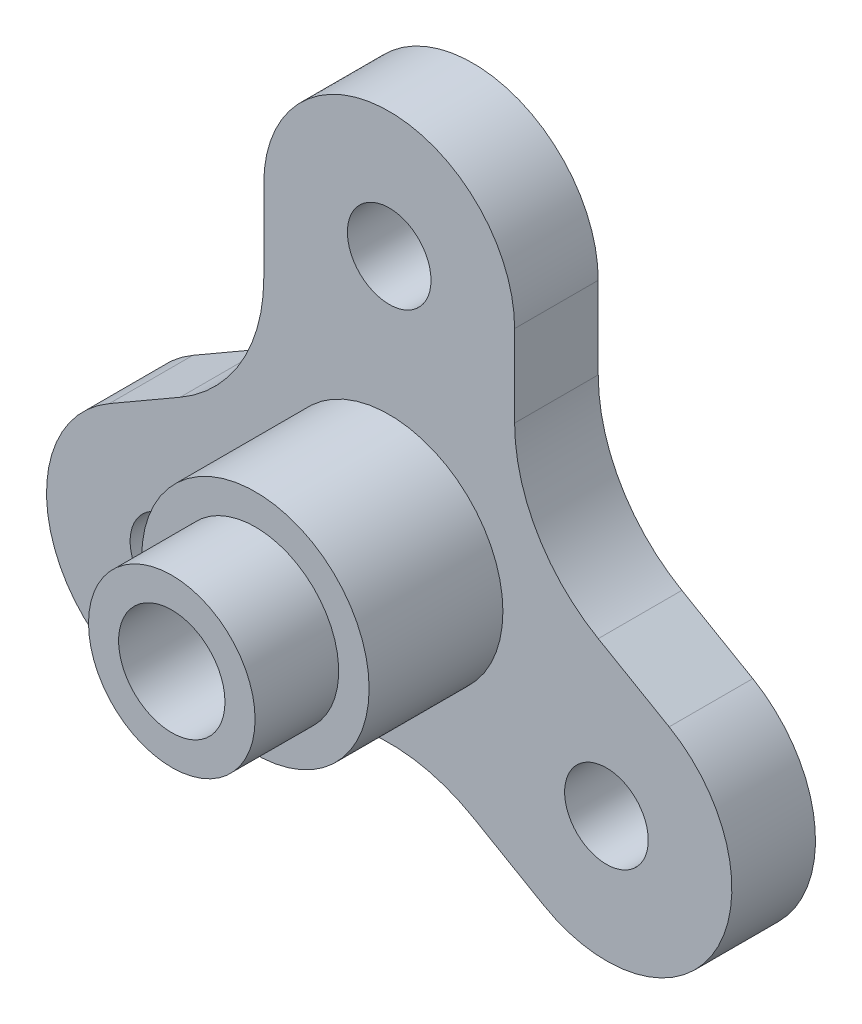
ISO-10303-21;
HEADER;
FILE_DESCRIPTION(('STEP AP214'),'2;1');
FILE_NAME('part.step','',(''),(''),'','','');
FILE_SCHEMA(('AUTOMOTIVE_DESIGN { 1 0 10303 214 1 1 1 1 }'));
ENDSEC;
DATA;
#1=APPLICATION_CONTEXT('core data for automotive mechanical design processes');
#2=APPLICATION_PROTOCOL_DEFINITION('international standard','automotive_design',2000,#1);
#3=PRODUCT_CONTEXT('',#1,'mechanical');
#4=PRODUCT('Part','Part','',(#3));
#5=PRODUCT_RELATED_PRODUCT_CATEGORY('part','',(#4));
#6=PRODUCT_DEFINITION_FORMATION('','',#4);
#7=PRODUCT_DEFINITION_CONTEXT('part definition',#1,'design');
#8=PRODUCT_DEFINITION('design','',#6,#7);
#9=PRODUCT_DEFINITION_SHAPE('','',#8);
#10=(LENGTH_UNIT() NAMED_UNIT(*) SI_UNIT(.MILLI.,.METRE.));
#11=(NAMED_UNIT(*) PLANE_ANGLE_UNIT() SI_UNIT($,.RADIAN.));
#12=(NAMED_UNIT(*) SI_UNIT($,.STERADIAN.) SOLID_ANGLE_UNIT());
#13=UNCERTAINTY_MEASURE_WITH_UNIT(LENGTH_MEASURE(1.E-05),#10,'distance_accuracy_value','');
#14=(GEOMETRIC_REPRESENTATION_CONTEXT(3) GLOBAL_UNCERTAINTY_ASSIGNED_CONTEXT((#13)) GLOBAL_UNIT_ASSIGNED_CONTEXT((#10,
#11,#12)) REPRESENTATION_CONTEXT('',''));
#15=CARTESIAN_POINT('',(0.,0.,0.));
#16=DIRECTION('',(0.,0.,1.));
#17=DIRECTION('',(1.,0.,0.));
#18=AXIS2_PLACEMENT_3D('',#15,#16,#17);
#19=CARTESIAN_POINT('',(0.,2.0193,0.));
#20=DIRECTION('',(0.,0.,-1.));
#21=DIRECTION('',(-1.,0.,0.));
#22=AXIS2_PLACEMENT_3D('',#19,#20,#21);
#23=PLANE('',#22);
#24=CARTESIAN_POINT('',(0.,0.,0.));
#25=DIRECTION('',(0.,0.,1.));
#26=DIRECTION('',(1.,0.,0.));
#27=AXIS2_PLACEMENT_3D('',#24,#25,#26);
#28=CIRCLE('',#27,4.318);
#29=CARTESIAN_POINT('',(4.318,0.,0.));
#30=VERTEX_POINT('',#29);
#31=EDGE_CURVE('E199',#30,#30,#28,.T.);
#32=ORIENTED_EDGE('',*,*,#31,.T.);
#33=EDGE_LOOP('',(#32));
#34=FACE_BOUND('',#33,.T.);
#35=CARTESIAN_POINT('',(0.,0.,0.));
#36=DIRECTION('',(0.,0.,-1.));
#37=DIRECTION('',(-1.,0.,0.));
#38=AXIS2_PLACEMENT_3D('',#35,#36,#37);
#39=CIRCLE('',#38,3.1623);
#40=CARTESIAN_POINT('',(-3.1623,0.,0.));
#41=VERTEX_POINT('',#40);
#42=EDGE_CURVE('E11',#41,#41,#39,.F.);
#43=ORIENTED_EDGE('',*,*,#42,.F.);
#44=EDGE_LOOP('',(#43));
#45=FACE_BOUND('',#44,.T.);
#46=ADVANCED_FACE('F34',(#34,#45),#23,.F.);
#47=CARTESIAN_POINT('',(0.,0.,0.));
#48=DIRECTION('',(0.,0.,1.));
#49=DIRECTION('',(1.,0.,0.));
#50=AXIS2_PLACEMENT_3D('',#47,#48,#49);
#51=CYLINDRICAL_SURFACE('',#50,2.0193);
#52=CARTESIAN_POINT('',(0.,0.,-8.255));
#53=DIRECTION('',(0.,0.,1.));
#54=DIRECTION('',(1.,0.,0.));
#55=AXIS2_PLACEMENT_3D('',#52,#53,#54);
#56=CIRCLE('',#55,2.0193);
#57=CARTESIAN_POINT('',(2.0193,0.,-8.255));
#58=VERTEX_POINT('',#57);
#59=EDGE_CURVE('E193',#58,#58,#56,.T.);
#60=ORIENTED_EDGE('',*,*,#59,.F.);
#61=EDGE_LOOP('',(#60));
#62=FACE_BOUND('',#61,.T.);
#63=CARTESIAN_POINT('',(0.,0.,3.175));
#64=DIRECTION('',(0.,0.,1.));
#65=DIRECTION('',(1.,0.,0.));
#66=AXIS2_PLACEMENT_3D('',#63,#64,#65);
#67=CIRCLE('',#66,2.0193);
#68=CARTESIAN_POINT('',(2.0193,0.,3.175));
#69=VERTEX_POINT('',#68);
#70=EDGE_CURVE('E390',#69,#69,#67,.T.);
#71=ORIENTED_EDGE('',*,*,#70,.T.);
#72=EDGE_LOOP('',(#71));
#73=FACE_BOUND('',#72,.T.);
#74=ADVANCED_FACE('F271',(#62,#73),#51,.F.);
#75=CARTESIAN_POINT('',(0.,0.,0.));
#76=DIRECTION('',(0.,0.,1.));
#77=DIRECTION('',(1.,0.,0.));
#78=AXIS2_PLACEMENT_3D('',#75,#76,#77);
#79=CYLINDRICAL_SURFACE('',#78,4.318);
#80=ORIENTED_EDGE('',*,*,#31,.F.);
#81=EDGE_LOOP('',(#80));
#82=FACE_BOUND('',#81,.T.);
#83=CARTESIAN_POINT('',(0.,0.,-5.08));
#84=DIRECTION('',(0.,0.,1.));
#85=DIRECTION('',(1.,0.,0.));
#86=AXIS2_PLACEMENT_3D('',#83,#84,#85);
#87=CIRCLE('',#86,4.318);
#88=CARTESIAN_POINT('',(4.318,0.,-5.08));
#89=VERTEX_POINT('',#88);
#90=EDGE_CURVE('E196',#89,#89,#87,.T.);
#91=ORIENTED_EDGE('',*,*,#90,.T.);
#92=EDGE_LOOP('',(#91));
#93=FACE_BOUND('',#92,.T.);
#94=ADVANCED_FACE('F277',(#82,#93),#79,.T.);
#95=CARTESIAN_POINT('',(0.,4.318,-5.08));
#96=DIRECTION('',(0.,0.,-1.));
#97=DIRECTION('',(-1.,0.,0.));
#98=AXIS2_PLACEMENT_3D('',#95,#96,#97);
#99=PLANE('',#98);
#100=DIRECTION('',(0.866025403784436,0.500000000000004,0.));
#101=VECTOR('',#100,1.);
#102=CARTESIAN_POINT('',(2.38124999999988,-4.12444598552313,-5.08));
#103=LINE('',#102,#101);
#104=CARTESIAN_POINT('',(-5.86764197104688,-8.88694598552317,-5.08));
#105=VERTEX_POINT('',#104);
#106=CARTESIAN_POINT('',(-3.17500000000047,-7.33234841870823,-5.08));
#107=VERTEX_POINT('',#106);
#108=EDGE_CURVE('E143',#105,#107,#103,.T.);
#109=ORIENTED_EDGE('',*,*,#108,.T.);
#110=CARTESIAN_POINT('',(-4.40619762898109E-13,-12.8316097327394,-5.08));
#111=DIRECTION('',(0.,0.,-1.));
#112=DIRECTION('',(-1.,0.,0.));
#113=AXIS2_PLACEMENT_3D('',#110,#111,#112);
#114=CIRCLE('',#113,6.35);
#115=CARTESIAN_POINT('',(3.17499999999957,-7.33234841870822,-5.08));
#116=VERTEX_POINT('',#115);
#117=EDGE_CURVE('E241',#107,#116,#114,.T.);
#118=ORIENTED_EDGE('',*,*,#117,.T.);
#119=DIRECTION('',(-0.866025403784438,0.500000000000001,0.));
#120=VECTOR('',#119,1.);
#121=CARTESIAN_POINT('',(-2.3812500000001,-4.12444598552354,-5.08));
#122=LINE('',#121,#120);
#123=CARTESIAN_POINT('',(5.86764197104666,-8.88694598552354,-5.08));
#124=VERTEX_POINT('',#123);
#125=EDGE_CURVE('E164',#124,#116,#122,.T.);
#126=ORIENTED_EDGE('',*,*,#125,.F.);
#127=CARTESIAN_POINT('',(8.24889197104668,-4.76250000000017,-5.08));
#128=DIRECTION('',(0.,0.,1.));
#129=DIRECTION('',(1.,0.,0.));
#130=AXIS2_PLACEMENT_3D('',#127,#128,#129);
#131=CIRCLE('',#130,4.7625);
#132=CARTESIAN_POINT('',(10.6301419710467,-0.638054014476789,-5.08));
#133=VERTEX_POINT('',#132);
#134=EDGE_CURVE('E161',#124,#133,#131,.T.);
#135=ORIENTED_EDGE('',*,*,#134,.T.);
#136=DIRECTION('',(-0.866025403784436,0.500000000000004,0.));
#137=VECTOR('',#136,1.);
#138=CARTESIAN_POINT('',(2.38124999999994,4.12444598552325,-5.08));
#139=LINE('',#138,#137);
#140=CARTESIAN_POINT('',(7.93750000000026,0.916543552338175,-5.08));
#141=VERTEX_POINT('',#140);
#142=EDGE_CURVE('E159',#133,#141,#139,.T.);
#143=ORIENTED_EDGE('',*,*,#142,.T.);
#144=CARTESIAN_POINT('',(11.1125000000003,6.41580486636934,-5.08));
#145=DIRECTION('',(0.,0.,-1.));
#146=DIRECTION('',(-1.,0.,0.));
#147=AXIS2_PLACEMENT_3D('',#144,#145,#146);
#148=CIRCLE('',#147,6.35);
#149=CARTESIAN_POINT('',(4.76250000000028,6.41580486636934,-5.08));
#150=VERTEX_POINT('',#149);
#151=EDGE_CURVE('E57',#141,#150,#148,.T.);
#152=ORIENTED_EDGE('',*,*,#151,.T.);
#153=DIRECTION('',(0.,-1.,0.));
#154=VECTOR('',#153,1.);
#155=CARTESIAN_POINT('',(4.76250000000028,0.,-5.08));
#156=LINE('',#155,#154);
#157=CARTESIAN_POINT('',(4.76250000000028,9.525,-5.08));
#158=VERTEX_POINT('',#157);
#159=EDGE_CURVE('E157',#158,#150,#156,.T.);
#160=ORIENTED_EDGE('',*,*,#159,.F.);
#161=CARTESIAN_POINT('',(2.81579709548073E-13,9.525,-5.08));
#162=DIRECTION('',(0.,0.,1.));
#163=DIRECTION('',(1.,0.,0.));
#164=AXIS2_PLACEMENT_3D('',#161,#162,#163);
#165=CIRCLE('',#164,4.7625);
#166=CARTESIAN_POINT('',(-4.76249999999972,9.525,-5.08));
#167=VERTEX_POINT('',#166);
#168=EDGE_CURVE('E151',#167,#158,#165,.F.);
#169=ORIENTED_EDGE('',*,*,#168,.F.);
#170=DIRECTION('',(0.,-1.,0.));
#171=VECTOR('',#170,1.);
#172=CARTESIAN_POINT('',(-4.76249999999972,0.,-5.08));
#173=LINE('',#172,#171);
#174=CARTESIAN_POINT('',(-4.76249999999972,6.41580486637017,-5.08));
#175=VERTEX_POINT('',#174);
#176=EDGE_CURVE('E149',#167,#175,#173,.T.);
#177=ORIENTED_EDGE('',*,*,#176,.T.);
#178=CARTESIAN_POINT('',(-11.1124999999997,6.41580486637017,-5.08));
#179=DIRECTION('',(0.,0.,-1.));
#180=DIRECTION('',(-1.,0.,0.));
#181=AXIS2_PLACEMENT_3D('',#178,#179,#180);
#182=CIRCLE('',#181,6.35);
#183=CARTESIAN_POINT('',(-7.93749999999969,0.916543552339002,-5.08));
#184=VERTEX_POINT('',#183);
#185=EDGE_CURVE('E148',#175,#184,#182,.T.);
#186=ORIENTED_EDGE('',*,*,#185,.T.);
#187=DIRECTION('',(0.866025403784436,0.500000000000004,0.));
#188=VECTOR('',#187,1.);
#189=CARTESIAN_POINT('',(-2.38125000000016,4.12444598552362,-5.08));
#190=LINE('',#189,#188);
#191=CARTESIAN_POINT('',(-10.6301419710469,-0.638054014476417,-5.08));
#192=VERTEX_POINT('',#191);
#193=EDGE_CURVE('E128',#192,#184,#190,.T.);
#194=ORIENTED_EDGE('',*,*,#193,.F.);
#195=CARTESIAN_POINT('',(-8.2488919710469,-4.7624999999998,-5.08));
#196=DIRECTION('',(0.,0.,1.));
#197=DIRECTION('',(1.,0.,0.));
#198=AXIS2_PLACEMENT_3D('',#195,#196,#197);
#199=CIRCLE('',#198,4.7625);
#200=EDGE_CURVE('E139',#105,#192,#199,.F.);
#201=ORIENTED_EDGE('',*,*,#200,.F.);
#202=EDGE_LOOP('',(#109,#118,#126,#135,#143,#152,#160,#169,#177,#186,#194,#201));
#203=FACE_BOUND('',#202,.T.);
#204=CARTESIAN_POINT('',(8.24889197104668,-4.76250000000017,-5.08));
#205=DIRECTION('',(0.,0.,1.));
#206=DIRECTION('',(1.,0.,0.));
#207=AXIS2_PLACEMENT_3D('',#204,#205,#206);
#208=CIRCLE('',#207,1.5875);
#209=CARTESIAN_POINT('',(9.83639197104668,-4.76250000000017,-5.08));
#210=VERTEX_POINT('',#209);
#211=EDGE_CURVE('E169',#210,#210,#208,.T.);
#212=ORIENTED_EDGE('',*,*,#211,.F.);
#213=EDGE_LOOP('',(#212));
#214=FACE_BOUND('',#213,.T.);
#215=CARTESIAN_POINT('',(-8.2488919710469,-4.7624999999998,-5.08));
#216=DIRECTION('',(0.,0.,1.));
#217=DIRECTION('',(1.,0.,0.));
#218=AXIS2_PLACEMENT_3D('',#215,#216,#217);
#219=CIRCLE('',#218,1.5875);
#220=CARTESIAN_POINT('',(-6.6613919710469,-4.7624999999998,-5.08));
#221=VERTEX_POINT('',#220);
#222=EDGE_CURVE('E181',#221,#221,#219,.T.);
#223=ORIENTED_EDGE('',*,*,#222,.F.);
#224=EDGE_LOOP('',(#223));
#225=FACE_BOUND('',#224,.T.);
#226=CARTESIAN_POINT('',(2.81579709548073E-13,9.525,-5.08));
#227=DIRECTION('',(0.,0.,1.));
#228=DIRECTION('',(1.,0.,0.));
#229=AXIS2_PLACEMENT_3D('',#226,#227,#228);
#230=CIRCLE('',#229,1.5875);
#231=CARTESIAN_POINT('',(1.58750000000028,9.525,-5.08));
#232=VERTEX_POINT('',#231);
#233=EDGE_CURVE('E187',#232,#232,#230,.T.);
#234=ORIENTED_EDGE('',*,*,#233,.F.);
#235=EDGE_LOOP('',(#234));
#236=FACE_BOUND('',#235,.T.);
#237=ORIENTED_EDGE('',*,*,#90,.F.);
#238=EDGE_LOOP('',(#237));
#239=FACE_BOUND('',#238,.T.);
#240=ADVANCED_FACE('F145',(#203,#214,#225,#236,#239),#99,.F.);
#241=CARTESIAN_POINT('',(0.,15.875,-8.255));
#242=DIRECTION('',(0.,0.,1.));
#243=DIRECTION('',(1.,0.,0.));
#244=AXIS2_PLACEMENT_3D('',#241,#242,#243);
#245=PLANE('',#244);
#246=DIRECTION('',(0.866025403784436,0.500000000000004,0.));
#247=VECTOR('',#246,1.);
#248=CARTESIAN_POINT('',(9.2553266425389,-0.155695985523067,-8.255));
#249=LINE('',#248,#247);
#250=CARTESIAN_POINT('',(-5.86764197104688,-8.88694598552317,-8.255));
#251=VERTEX_POINT('',#250);
#252=CARTESIAN_POINT('',(-3.17500000000047,-7.33234841870823,-8.255));
#253=VERTEX_POINT('',#252);
#254=EDGE_CURVE('E221',#251,#253,#249,.T.);
#255=ORIENTED_EDGE('',*,*,#254,.F.);
#256=CARTESIAN_POINT('',(-8.2488919710469,-4.7624999999998,-8.255));
#257=DIRECTION('',(0.,0.,1.));
#258=DIRECTION('',(1.,0.,0.));
#259=AXIS2_PLACEMENT_3D('',#256,#257,#258);
#260=CIRCLE('',#259,4.7625);
#261=CARTESIAN_POINT('',(-10.6301419710469,-0.638054014476417,-8.255));
#262=VERTEX_POINT('',#261);
#263=EDGE_CURVE('E202',#251,#262,#260,.F.);
#264=ORIENTED_EDGE('',*,*,#263,.T.);
#265=DIRECTION('',(0.866025403784436,0.500000000000004,0.));
#266=VECTOR('',#265,1.);
#267=CARTESIAN_POINT('',(4.49282664253886,8.09319598552368,-8.255));
#268=LINE('',#267,#266);
#269=CARTESIAN_POINT('',(-7.93749999999969,0.916543552338999,-8.255));
#270=VERTEX_POINT('',#269);
#271=EDGE_CURVE('E131',#262,#270,#268,.T.);
#272=ORIENTED_EDGE('',*,*,#271,.T.);
#273=CARTESIAN_POINT('',(-11.1124999999997,6.41580486637017,-8.255));
#274=DIRECTION('',(0.,0.,1.));
#275=DIRECTION('',(1.,0.,0.));
#276=AXIS2_PLACEMENT_3D('',#273,#274,#275);
#277=CIRCLE('',#276,6.35);
#278=CARTESIAN_POINT('',(-4.76249999999972,6.41580486637017,-8.255));
#279=VERTEX_POINT('',#278);
#280=EDGE_CURVE('E239',#270,#279,#277,.T.);
#281=ORIENTED_EDGE('',*,*,#280,.T.);
#282=DIRECTION('',(0.,-1.,0.));
#283=VECTOR('',#282,1.);
#284=CARTESIAN_POINT('',(-4.76249999999972,15.875,-8.255));
#285=LINE('',#284,#283);
#286=CARTESIAN_POINT('',(-4.76249999999972,9.525,-8.255));
#287=VERTEX_POINT('',#286);
#288=EDGE_CURVE('E205',#287,#279,#285,.T.);
#289=ORIENTED_EDGE('',*,*,#288,.F.);
#290=CARTESIAN_POINT('',(2.81579709548073E-13,9.525,-8.255));
#291=DIRECTION('',(0.,0.,1.));
#292=DIRECTION('',(1.,0.,0.));
#293=AXIS2_PLACEMENT_3D('',#290,#291,#292);
#294=CIRCLE('',#293,4.7625);
#295=CARTESIAN_POINT('',(4.76250000000028,9.525,-8.255));
#296=VERTEX_POINT('',#295);
#297=EDGE_CURVE('E208',#287,#296,#294,.F.);
#298=ORIENTED_EDGE('',*,*,#297,.T.);
#299=DIRECTION('',(0.,-1.,0.));
#300=VECTOR('',#299,1.);
#301=CARTESIAN_POINT('',(4.76250000000028,15.875,-8.255));
#302=LINE('',#301,#300);
#303=CARTESIAN_POINT('',(4.76250000000028,6.41580486636934,-8.255));
#304=VERTEX_POINT('',#303);
#305=EDGE_CURVE('E211',#296,#304,#302,.T.);
#306=ORIENTED_EDGE('',*,*,#305,.T.);
#307=CARTESIAN_POINT('',(11.1125000000003,6.41580486636934,-8.255));
#308=DIRECTION('',(0.,0.,1.));
#309=DIRECTION('',(1.,0.,0.));
#310=AXIS2_PLACEMENT_3D('',#307,#308,#309);
#311=CIRCLE('',#310,6.35);
#312=CARTESIAN_POINT('',(7.93750000000026,0.916543552338173,-8.255));
#313=VERTEX_POINT('',#312);
#314=EDGE_CURVE('E42',#304,#313,#311,.T.);
#315=ORIENTED_EDGE('',*,*,#314,.T.);
#316=DIRECTION('',(-0.866025403784436,0.500000000000004,0.));
#317=VECTOR('',#316,1.);
#318=CARTESIAN_POINT('',(-4.49282664253908,8.09319598552331,-8.255));
#319=LINE('',#318,#317);
#320=CARTESIAN_POINT('',(10.6301419710467,-0.638054014476789,-8.255));
#321=VERTEX_POINT('',#320);
#322=EDGE_CURVE('E213',#321,#313,#319,.T.);
#323=ORIENTED_EDGE('',*,*,#322,.F.);
#324=CARTESIAN_POINT('',(8.24889197104668,-4.76250000000017,-8.255));
#325=DIRECTION('',(0.,0.,1.));
#326=DIRECTION('',(1.,0.,0.));
#327=AXIS2_PLACEMENT_3D('',#324,#325,#326);
#328=CIRCLE('',#327,4.7625);
#329=CARTESIAN_POINT('',(5.86764197104666,-8.88694598552354,-8.255));
#330=VERTEX_POINT('',#329);
#331=EDGE_CURVE('E216',#330,#321,#328,.T.);
#332=ORIENTED_EDGE('',*,*,#331,.F.);
#333=DIRECTION('',(-0.866025403784438,0.500000000000001,0.));
#334=VECTOR('',#333,1.);
#335=CARTESIAN_POINT('',(-9.25532664253909,-0.155695985523528,-8.255));
#336=LINE('',#335,#334);
#337=CARTESIAN_POINT('',(3.17499999999957,-7.33234841870822,-8.255));
#338=VERTEX_POINT('',#337);
#339=EDGE_CURVE('E218',#330,#338,#336,.T.);
#340=ORIENTED_EDGE('',*,*,#339,.T.);
#341=CARTESIAN_POINT('',(-4.40619762898109E-13,-12.8316097327394,-8.255));
#342=DIRECTION('',(0.,0.,1.));
#343=DIRECTION('',(1.,0.,0.));
#344=AXIS2_PLACEMENT_3D('',#341,#342,#343);
#345=CIRCLE('',#344,6.35);
#346=EDGE_CURVE('E243',#338,#253,#345,.T.);
#347=ORIENTED_EDGE('',*,*,#346,.T.);
#348=EDGE_LOOP('',(#255,#264,#272,#281,#289,#298,#306,#315,#323,#332,#340,#347));
#349=FACE_BOUND('',#348,.T.);
#350=CARTESIAN_POINT('',(8.24889197104668,-4.76250000000017,-8.255));
#351=DIRECTION('',(0.,0.,1.));
#352=DIRECTION('',(1.,0.,0.));
#353=AXIS2_PLACEMENT_3D('',#350,#351,#352);
#354=CIRCLE('',#353,1.5875);
#355=CARTESIAN_POINT('',(9.83639197104668,-4.76250000000017,-8.255));
#356=VERTEX_POINT('',#355);
#357=EDGE_CURVE('E178',#356,#356,#354,.T.);
#358=ORIENTED_EDGE('',*,*,#357,.T.);
#359=EDGE_LOOP('',(#358));
#360=FACE_BOUND('',#359,.T.);
#361=CARTESIAN_POINT('',(-8.2488919710469,-4.7624999999998,-8.255));
#362=DIRECTION('',(0.,0.,1.));
#363=DIRECTION('',(1.,0.,0.));
#364=AXIS2_PLACEMENT_3D('',#361,#362,#363);
#365=CIRCLE('',#364,1.5875);
#366=CARTESIAN_POINT('',(-6.6613919710469,-4.7624999999998,-8.255));
#367=VERTEX_POINT('',#366);
#368=EDGE_CURVE('E184',#367,#367,#365,.T.);
#369=ORIENTED_EDGE('',*,*,#368,.T.);
#370=EDGE_LOOP('',(#369));
#371=FACE_BOUND('',#370,.T.);
#372=CARTESIAN_POINT('',(2.81579709548073E-13,9.525,-8.255));
#373=DIRECTION('',(0.,0.,1.));
#374=DIRECTION('',(1.,0.,0.));
#375=AXIS2_PLACEMENT_3D('',#372,#373,#374);
#376=CIRCLE('',#375,1.5875);
#377=CARTESIAN_POINT('',(1.58750000000028,9.525,-8.255));
#378=VERTEX_POINT('',#377);
#379=EDGE_CURVE('E190',#378,#378,#376,.T.);
#380=ORIENTED_EDGE('',*,*,#379,.T.);
#381=EDGE_LOOP('',(#380));
#382=FACE_BOUND('',#381,.T.);
#383=ORIENTED_EDGE('',*,*,#59,.T.);
#384=EDGE_LOOP('',(#383));
#385=FACE_BOUND('',#384,.T.);
#386=ADVANCED_FACE('F249',(#349,#360,#371,#382,#385),#245,.F.);
#387=CARTESIAN_POINT('',(2.81579709548073E-13,9.525,-5.08));
#388=DIRECTION('',(0.,0.,1.));
#389=DIRECTION('',(1.,0.,0.));
#390=AXIS2_PLACEMENT_3D('',#387,#388,#389);
#391=CYLINDRICAL_SURFACE('',#390,1.5875);
#392=ORIENTED_EDGE('',*,*,#379,.F.);
#393=EDGE_LOOP('',(#392));
#394=FACE_BOUND('',#393,.T.);
#395=ORIENTED_EDGE('',*,*,#233,.T.);
#396=EDGE_LOOP('',(#395));
#397=FACE_BOUND('',#396,.T.);
#398=ADVANCED_FACE('F329',(#394,#397),#391,.F.);
#399=CARTESIAN_POINT('',(-8.2488919710469,-4.7624999999998,-5.08));
#400=DIRECTION('',(0.,0.,1.));
#401=DIRECTION('',(1.,0.,0.));
#402=AXIS2_PLACEMENT_3D('',#399,#400,#401);
#403=CYLINDRICAL_SURFACE('',#402,1.5875);
#404=ORIENTED_EDGE('',*,*,#368,.F.);
#405=EDGE_LOOP('',(#404));
#406=FACE_BOUND('',#405,.T.);
#407=ORIENTED_EDGE('',*,*,#222,.T.);
#408=EDGE_LOOP('',(#407));
#409=FACE_BOUND('',#408,.T.);
#410=ADVANCED_FACE('F325',(#406,#409),#403,.F.);
#411=CARTESIAN_POINT('',(8.24889197104668,-4.76250000000017,-5.08));
#412=DIRECTION('',(0.,0.,1.));
#413=DIRECTION('',(1.,0.,0.));
#414=AXIS2_PLACEMENT_3D('',#411,#412,#413);
#415=CYLINDRICAL_SURFACE('',#414,1.5875);
#416=ORIENTED_EDGE('',*,*,#357,.F.);
#417=EDGE_LOOP('',(#416));
#418=FACE_BOUND('',#417,.T.);
#419=ORIENTED_EDGE('',*,*,#211,.T.);
#420=EDGE_LOOP('',(#419));
#421=FACE_BOUND('',#420,.T.);
#422=ADVANCED_FACE('F321',(#418,#421),#415,.F.);
#423=CARTESIAN_POINT('',(2.38124999999988,-4.12444598552313,-15.08));
#424=DIRECTION('',(0.500000000000004,-0.866025403784436,0.));
#425=DIRECTION('',(0.866025403784436,0.500000000000004,0.));
#426=AXIS2_PLACEMENT_3D('',#423,#424,#425);
#427=PLANE('',#426);
#428=ORIENTED_EDGE('',*,*,#254,.T.);
#429=DIRECTION('',(0.,0.,1.));
#430=VECTOR('',#429,1.);
#431=CARTESIAN_POINT('',(-3.17500000000047,-7.33234841870823,-15.08));
#432=LINE('',#431,#430);
#433=EDGE_CURVE('E229',#253,#107,#432,.T.);
#434=ORIENTED_EDGE('',*,*,#433,.T.);
#435=ORIENTED_EDGE('',*,*,#108,.F.);
#436=DIRECTION('',(0.,0.,1.));
#437=VECTOR('',#436,1.);
#438=CARTESIAN_POINT('',(-5.86764197104688,-8.88694598552317,-15.08));
#439=LINE('',#438,#437);
#440=EDGE_CURVE('E135',#251,#105,#439,.T.);
#441=ORIENTED_EDGE('',*,*,#440,.F.);
#442=EDGE_LOOP('',(#428,#434,#435,#441));
#443=FACE_BOUND('',#442,.T.);
#444=ADVANCED_FACE('F317',(#443),#427,.T.);
#445=CARTESIAN_POINT('',(-2.3812500000001,-4.12444598552354,-15.08));
#446=DIRECTION('',(0.500000000000001,0.866025403784438,0.));
#447=DIRECTION('',(-0.866025403784438,0.500000000000001,0.));
#448=AXIS2_PLACEMENT_3D('',#445,#446,#447);
#449=PLANE('',#448);
#450=ORIENTED_EDGE('',*,*,#125,.T.);
#451=DIRECTION('',(0.,0.,1.));
#452=VECTOR('',#451,1.);
#453=CARTESIAN_POINT('',(3.17499999999957,-7.33234841870821,-15.08));
#454=LINE('',#453,#452);
#455=EDGE_CURVE('E232',#116,#338,#454,.F.);
#456=ORIENTED_EDGE('',*,*,#455,.T.);
#457=ORIENTED_EDGE('',*,*,#339,.F.);
#458=DIRECTION('',(0.,0.,1.));
#459=VECTOR('',#458,1.);
#460=CARTESIAN_POINT('',(5.86764197104666,-8.88694598552354,-15.08));
#461=LINE('',#460,#459);
#462=EDGE_CURVE('E167',#330,#124,#461,.T.);
#463=ORIENTED_EDGE('',*,*,#462,.T.);
#464=EDGE_LOOP('',(#450,#456,#457,#463));
#465=FACE_BOUND('',#464,.T.);
#466=ADVANCED_FACE('F320',(#465),#449,.F.);
#467=CARTESIAN_POINT('',(8.24889197104668,-4.76250000000017,-15.08));
#468=DIRECTION('',(0.,0.,1.));
#469=DIRECTION('',(1.,0.,0.));
#470=AXIS2_PLACEMENT_3D('',#467,#468,#469);
#471=CYLINDRICAL_SURFACE('',#470,4.7625);
#472=ORIENTED_EDGE('',*,*,#331,.T.);
#473=DIRECTION('',(0.,0.,1.));
#474=VECTOR('',#473,1.);
#475=CARTESIAN_POINT('',(10.6301419710467,-0.638054014476789,-15.08));
#476=LINE('',#475,#474);
#477=EDGE_CURVE('E170',#321,#133,#476,.T.);
#478=ORIENTED_EDGE('',*,*,#477,.T.);
#479=ORIENTED_EDGE('',*,*,#134,.F.);
#480=ORIENTED_EDGE('',*,*,#462,.F.);
#481=EDGE_LOOP('',(#472,#478,#479,#480));
#482=FACE_BOUND('',#481,.T.);
#483=ADVANCED_FACE('F309',(#482),#471,.T.);
#484=CARTESIAN_POINT('',(2.38124999999994,4.12444598552325,-15.08));
#485=DIRECTION('',(0.500000000000004,0.866025403784436,0.));
#486=DIRECTION('',(-0.866025403784436,0.500000000000004,0.));
#487=AXIS2_PLACEMENT_3D('',#484,#485,#486);
#488=PLANE('',#487);
#489=ORIENTED_EDGE('',*,*,#322,.T.);
#490=DIRECTION('',(0.,0.,1.));
#491=VECTOR('',#490,1.);
#492=CARTESIAN_POINT('',(7.93750000000026,0.916543552338175,-15.08));
#493=LINE('',#492,#491);
#494=EDGE_CURVE('E234',#313,#141,#493,.T.);
#495=ORIENTED_EDGE('',*,*,#494,.T.);
#496=ORIENTED_EDGE('',*,*,#142,.F.);
#497=ORIENTED_EDGE('',*,*,#477,.F.);
#498=EDGE_LOOP('',(#489,#495,#496,#497));
#499=FACE_BOUND('',#498,.T.);
#500=ADVANCED_FACE('F256',(#499),#488,.T.);
#501=CARTESIAN_POINT('',(4.76250000000028,0.,-15.08));
#502=DIRECTION('',(-1.,0.,0.));
#503=DIRECTION('',(0.,0.,1.));
#504=AXIS2_PLACEMENT_3D('',#501,#502,#503);
#505=PLANE('',#504);
#506=ORIENTED_EDGE('',*,*,#159,.T.);
#507=DIRECTION('',(0.,0.,1.));
#508=VECTOR('',#507,1.);
#509=CARTESIAN_POINT('',(4.76250000000028,6.41580486636934,-15.08));
#510=LINE('',#509,#508);
#511=EDGE_CURVE('E49',#150,#304,#510,.F.);
#512=ORIENTED_EDGE('',*,*,#511,.T.);
#513=ORIENTED_EDGE('',*,*,#305,.F.);
#514=DIRECTION('',(0.,0.,1.));
#515=VECTOR('',#514,1.);
#516=CARTESIAN_POINT('',(4.76250000000028,9.525,-15.08));
#517=LINE('',#516,#515);
#518=EDGE_CURVE('E172',#296,#158,#517,.T.);
#519=ORIENTED_EDGE('',*,*,#518,.T.);
#520=EDGE_LOOP('',(#506,#512,#513,#519));
#521=FACE_BOUND('',#520,.T.);
#522=ADVANCED_FACE('F301',(#521),#505,.F.);
#523=CARTESIAN_POINT('',(2.81579709548073E-13,9.525,-15.08));
#524=DIRECTION('',(0.,0.,1.));
#525=DIRECTION('',(1.,0.,0.));
#526=AXIS2_PLACEMENT_3D('',#523,#524,#525);
#527=CYLINDRICAL_SURFACE('',#526,4.7625);
#528=DIRECTION('',(0.,0.,1.));
#529=VECTOR('',#528,1.);
#530=CARTESIAN_POINT('',(-4.76249999999972,9.525,-15.08));
#531=LINE('',#530,#529);
#532=EDGE_CURVE('E134',#287,#167,#531,.T.);
#533=ORIENTED_EDGE('',*,*,#532,.T.);
#534=ORIENTED_EDGE('',*,*,#168,.T.);
#535=ORIENTED_EDGE('',*,*,#518,.F.);
#536=ORIENTED_EDGE('',*,*,#297,.F.);
#537=EDGE_LOOP('',(#533,#534,#535,#536));
#538=FACE_BOUND('',#537,.T.);
#539=ADVANCED_FACE('F299',(#538),#527,.T.);
#540=CARTESIAN_POINT('',(-4.76249999999972,0.,-15.08));
#541=DIRECTION('',(-1.,0.,0.));
#542=DIRECTION('',(0.,0.,1.));
#543=AXIS2_PLACEMENT_3D('',#540,#541,#542);
#544=PLANE('',#543);
#545=ORIENTED_EDGE('',*,*,#288,.T.);
#546=DIRECTION('',(0.,0.,1.));
#547=VECTOR('',#546,1.);
#548=CARTESIAN_POINT('',(-4.76249999999972,6.41580486637017,-15.08));
#549=LINE('',#548,#547);
#550=EDGE_CURVE('E224',#279,#175,#549,.T.);
#551=ORIENTED_EDGE('',*,*,#550,.T.);
#552=ORIENTED_EDGE('',*,*,#176,.F.);
#553=ORIENTED_EDGE('',*,*,#532,.F.);
#554=EDGE_LOOP('',(#545,#551,#552,#553));
#555=FACE_BOUND('',#554,.T.);
#556=ADVANCED_FACE('F295',(#555),#544,.T.);
#557=CARTESIAN_POINT('',(-2.38125000000016,4.12444598552362,-15.08));
#558=DIRECTION('',(0.500000000000004,-0.866025403784436,0.));
#559=DIRECTION('',(0.866025403784436,0.500000000000004,0.));
#560=AXIS2_PLACEMENT_3D('',#557,#558,#559);
#561=PLANE('',#560);
#562=ORIENTED_EDGE('',*,*,#193,.T.);
#563=DIRECTION('',(0.,0.,1.));
#564=VECTOR('',#563,1.);
#565=CARTESIAN_POINT('',(-7.93749999999969,0.916543552339002,-15.08));
#566=LINE('',#565,#564);
#567=EDGE_CURVE('E227',#184,#270,#566,.F.);
#568=ORIENTED_EDGE('',*,*,#567,.T.);
#569=ORIENTED_EDGE('',*,*,#271,.F.);
#570=DIRECTION('',(0.,0.,1.));
#571=VECTOR('',#570,1.);
#572=CARTESIAN_POINT('',(-10.6301419710469,-0.638054014476417,-15.08));
#573=LINE('',#572,#571);
#574=EDGE_CURVE('E124',#262,#192,#573,.T.);
#575=ORIENTED_EDGE('',*,*,#574,.T.);
#576=EDGE_LOOP('',(#562,#568,#569,#575));
#577=FACE_BOUND('',#576,.T.);
#578=ADVANCED_FACE('F126',(#577),#561,.F.);
#579=CARTESIAN_POINT('',(-8.2488919710469,-4.7624999999998,-15.08));
#580=DIRECTION('',(0.,0.,1.));
#581=DIRECTION('',(1.,0.,0.));
#582=AXIS2_PLACEMENT_3D('',#579,#580,#581);
#583=CYLINDRICAL_SURFACE('',#582,4.7625);
#584=ORIENTED_EDGE('',*,*,#440,.T.);
#585=ORIENTED_EDGE('',*,*,#200,.T.);
#586=ORIENTED_EDGE('',*,*,#574,.F.);
#587=ORIENTED_EDGE('',*,*,#263,.F.);
#588=EDGE_LOOP('',(#584,#585,#586,#587));
#589=FACE_BOUND('',#588,.T.);
#590=ADVANCED_FACE('F140',(#589),#583,.T.);
#591=CARTESIAN_POINT('',(-11.1124999999997,6.41580486637017,-15.08));
#592=DIRECTION('',(0.,0.,1.));
#593=DIRECTION('',(1.,0.,0.));
#594=AXIS2_PLACEMENT_3D('',#591,#592,#593);
#595=CYLINDRICAL_SURFACE('',#594,6.35);
#596=ORIENTED_EDGE('',*,*,#280,.F.);
#597=ORIENTED_EDGE('',*,*,#567,.F.);
#598=ORIENTED_EDGE('',*,*,#185,.F.);
#599=ORIENTED_EDGE('',*,*,#550,.F.);
#600=EDGE_LOOP('',(#596,#597,#598,#599));
#601=FACE_BOUND('',#600,.T.);
#602=ADVANCED_FACE('F268',(#601),#595,.F.);
#603=CARTESIAN_POINT('',(-4.40619762898109E-13,-12.8316097327394,-15.08));
#604=DIRECTION('',(0.,0.,1.));
#605=DIRECTION('',(1.,0.,0.));
#606=AXIS2_PLACEMENT_3D('',#603,#604,#605);
#607=CYLINDRICAL_SURFACE('',#606,6.35);
#608=ORIENTED_EDGE('',*,*,#346,.F.);
#609=ORIENTED_EDGE('',*,*,#455,.F.);
#610=ORIENTED_EDGE('',*,*,#117,.F.);
#611=ORIENTED_EDGE('',*,*,#433,.F.);
#612=EDGE_LOOP('',(#608,#609,#610,#611));
#613=FACE_BOUND('',#612,.T.);
#614=ADVANCED_FACE('F260',(#613),#607,.F.);
#615=CARTESIAN_POINT('',(11.1125000000003,6.41580486636934,-15.08));
#616=DIRECTION('',(0.,0.,1.));
#617=DIRECTION('',(1.,0.,0.));
#618=AXIS2_PLACEMENT_3D('',#615,#616,#617);
#619=CYLINDRICAL_SURFACE('',#618,6.35);
#620=ORIENTED_EDGE('',*,*,#314,.F.);
#621=ORIENTED_EDGE('',*,*,#511,.F.);
#622=ORIENTED_EDGE('',*,*,#151,.F.);
#623=ORIENTED_EDGE('',*,*,#494,.F.);
#624=EDGE_LOOP('',(#620,#621,#622,#623));
#625=FACE_BOUND('',#624,.T.);
#626=ADVANCED_FACE('F36',(#625),#619,.F.);
#627=CARTESIAN_POINT('',(0.,0.,3.175));
#628=DIRECTION('',(0.,0.,1.));
#629=DIRECTION('',(1.,0.,0.));
#630=AXIS2_PLACEMENT_3D('',#627,#628,#629);
#631=PLANE('',#630);
#632=CARTESIAN_POINT('',(0.,0.,3.175));
#633=DIRECTION('',(0.,0.,1.));
#634=DIRECTION('',(1.,0.,0.));
#635=AXIS2_PLACEMENT_3D('',#632,#633,#634);
#636=CIRCLE('',#635,3.1623);
#637=CARTESIAN_POINT('',(3.1623,0.,3.175));
#638=VERTEX_POINT('',#637);
#639=EDGE_CURVE('E388',#638,#638,#636,.T.);
#640=ORIENTED_EDGE('',*,*,#639,.T.);
#641=EDGE_LOOP('',(#640));
#642=FACE_BOUND('',#641,.T.);
#643=ORIENTED_EDGE('',*,*,#70,.F.);
#644=EDGE_LOOP('',(#643));
#645=FACE_BOUND('',#644,.T.);
#646=ADVANCED_FACE('F259',(#642,#645),#631,.T.);
#647=CARTESIAN_POINT('',(0.,0.,3.175));
#648=DIRECTION('',(0.,0.,-1.));
#649=DIRECTION('',(-1.,0.,0.));
#650=AXIS2_PLACEMENT_3D('',#647,#648,#649);
#651=CYLINDRICAL_SURFACE('',#650,3.1623);
#652=ORIENTED_EDGE('',*,*,#639,.F.);
#653=EDGE_LOOP('',(#652));
#654=FACE_BOUND('',#653,.T.);
#655=ORIENTED_EDGE('',*,*,#42,.T.);
#656=EDGE_LOOP('',(#655));
#657=FACE_BOUND('',#656,.T.);
#658=ADVANCED_FACE('F265',(#654,#657),#651,.T.);
#659=CLOSED_SHELL('',(#46,#74,#94,#240,#386,#398,#410,#422,#444,#466,#483,#500,#522,#539,#556,
#578,#590,#602,#614,#626,#646,#658));
#660=MANIFOLD_SOLID_BREP('B2',#659);
#661=ADVANCED_BREP_SHAPE_REPRESENTATION('',(#18,#660),#14);
#662=SHAPE_DEFINITION_REPRESENTATION(#9,#661);
ENDSEC;
END-ISO-10303-21;
